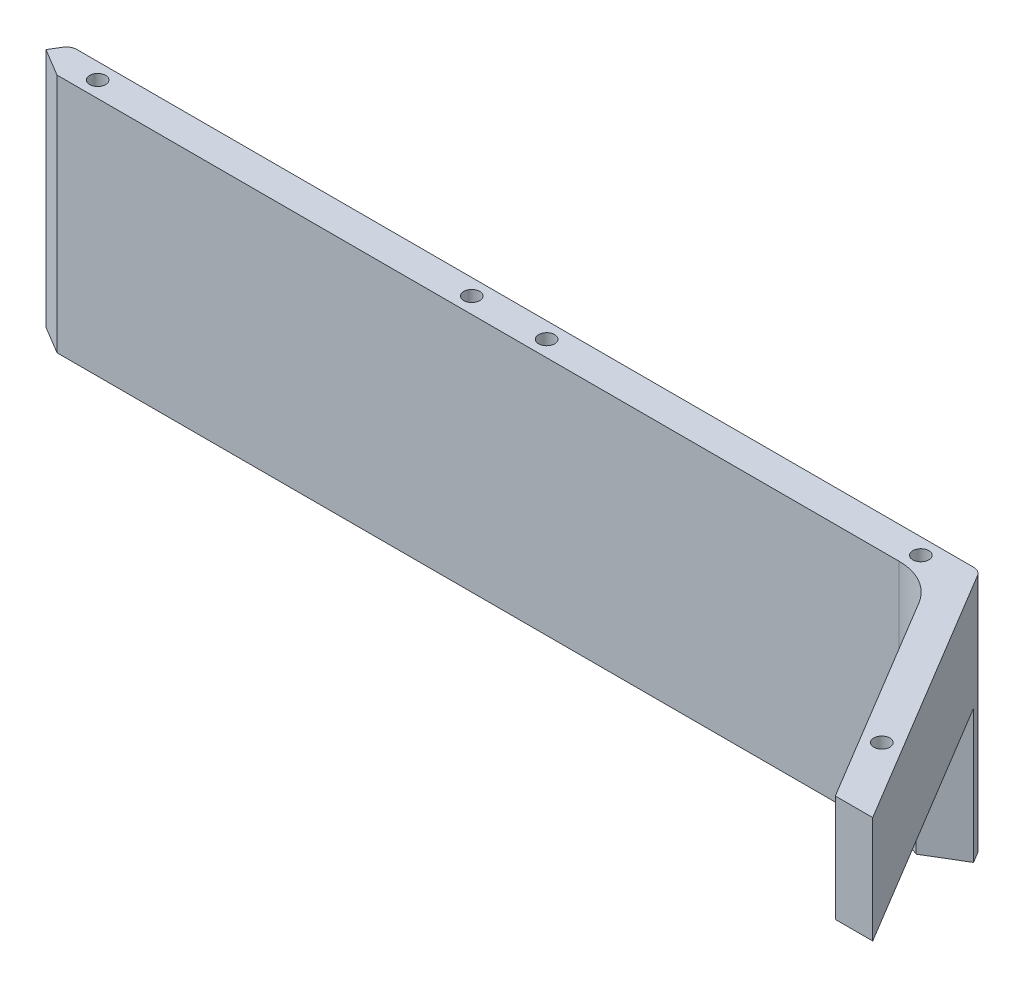
ISO-10303-21;
HEADER;
FILE_DESCRIPTION(('STEP AP214'),'2;1');
FILE_NAME('part.step','',(''),(''),'','','');
FILE_SCHEMA(('AUTOMOTIVE_DESIGN { 1 0 10303 214 1 1 1 1 }'));
ENDSEC;
DATA;
#1=APPLICATION_CONTEXT('core data for automotive mechanical design processes');
#2=APPLICATION_PROTOCOL_DEFINITION('international standard','automotive_design',2000,#1);
#3=PRODUCT_CONTEXT('',#1,'mechanical');
#4=PRODUCT('Part','Part','',(#3));
#5=PRODUCT_RELATED_PRODUCT_CATEGORY('part','',(#4));
#6=PRODUCT_DEFINITION_FORMATION('','',#4);
#7=PRODUCT_DEFINITION_CONTEXT('part definition',#1,'design');
#8=PRODUCT_DEFINITION('design','',#6,#7);
#9=PRODUCT_DEFINITION_SHAPE('','',#8);
#10=(LENGTH_UNIT() NAMED_UNIT(*) SI_UNIT(.MILLI.,.METRE.));
#11=(NAMED_UNIT(*) PLANE_ANGLE_UNIT() SI_UNIT($,.RADIAN.));
#12=(NAMED_UNIT(*) SI_UNIT($,.STERADIAN.) SOLID_ANGLE_UNIT());
#13=UNCERTAINTY_MEASURE_WITH_UNIT(LENGTH_MEASURE(1.E-05),#10,'distance_accuracy_value','');
#14=(GEOMETRIC_REPRESENTATION_CONTEXT(3) GLOBAL_UNCERTAINTY_ASSIGNED_CONTEXT((#13)) GLOBAL_UNIT_ASSIGNED_CONTEXT((#10,
#11,#12)) REPRESENTATION_CONTEXT('',''));
#15=CARTESIAN_POINT('',(0.,0.,0.));
#16=DIRECTION('',(0.,0.,1.));
#17=DIRECTION('',(1.,0.,0.));
#18=AXIS2_PLACEMENT_3D('',#15,#16,#17);
#19=CARTESIAN_POINT('',(115.,22.5,1.74329600357084E-13));
#20=DIRECTION('',(-0.857492925712544,0.,0.514495755427526));
#21=DIRECTION('',(0.514495755427526,0.,0.857492925712544));
#22=AXIS2_PLACEMENT_3D('',#19,#20,#21);
#23=PLANE('',#22);
#24=DIRECTION('',(0.,1.,0.));
#25=VECTOR('',#24,1.);
#26=CARTESIAN_POINT('',(86.7027334514861,2.5,-47.1621109141898));
#27=LINE('',#26,#25);
#28=CARTESIAN_POINT('',(86.7027334514861,-22.5,-47.1621109141898));
#29=VERTEX_POINT('',#28);
#30=CARTESIAN_POINT('',(86.7027334514861,2.5,-47.1621109141898));
#31=VERTEX_POINT('',#30);
#32=EDGE_CURVE('E247',#29,#31,#27,.T.);
#33=ORIENTED_EDGE('',*,*,#32,.F.);
#34=DIRECTION('',(-0.514495755427526,0.,-0.857492925712544));
#35=VECTOR('',#34,1.);
#36=CARTESIAN_POINT('',(115.,-22.5,1.74329600357084E-13));
#37=LINE('',#36,#35);
#38=CARTESIAN_POINT('',(85.582605093487,-22.5,-49.0289915108549));
#39=VERTEX_POINT('',#38);
#40=EDGE_CURVE('E176',#29,#39,#37,.T.);
#41=ORIENTED_EDGE('',*,*,#40,.T.);
#42=DIRECTION('',(0.,-1.,0.));
#43=VECTOR('',#42,1.);
#44=CARTESIAN_POINT('',(85.582605093487,22.5,-49.0289915108549));
#45=LINE('',#44,#43);
#46=CARTESIAN_POINT('',(85.582605093487,22.5,-49.0289915108549));
#47=VERTEX_POINT('',#46);
#48=EDGE_CURVE('E191',#39,#47,#45,.F.);
#49=ORIENTED_EDGE('',*,*,#48,.T.);
#50=DIRECTION('',(-0.514495755427526,0.,-0.857492925712544));
#51=VECTOR('',#50,1.);
#52=CARTESIAN_POINT('',(115.,22.5,1.74329600357084E-13));
#53=LINE('',#52,#51);
#54=CARTESIAN_POINT('',(115.,22.5,1.74329600357084E-13));
#55=VERTEX_POINT('',#54);
#56=EDGE_CURVE('E168',#55,#47,#53,.T.);
#57=ORIENTED_EDGE('',*,*,#56,.F.);
#58=DIRECTION('',(0.,-1.,0.));
#59=VECTOR('',#58,1.);
#60=CARTESIAN_POINT('',(115.,22.5,1.74329600357084E-13));
#61=LINE('',#60,#59);
#62=CARTESIAN_POINT('',(115.,2.50000000000001,1.74329600357084E-13));
#63=VERTEX_POINT('',#62);
#64=EDGE_CURVE('E173',#55,#63,#61,.T.);
#65=ORIENTED_EDGE('',*,*,#64,.T.);
#66=DIRECTION('',(0.514495755427526,0.,0.857492925712544));
#67=VECTOR('',#66,1.);
#68=CARTESIAN_POINT('',(115.,2.5,1.73472347597681E-13));
#69=LINE('',#68,#67);
#70=EDGE_CURVE('E249',#31,#63,#69,.T.);
#71=ORIENTED_EDGE('',*,*,#70,.F.);
#72=EDGE_LOOP('',(#33,#41,#49,#57,#65,#71));
#73=FACE_BOUND('',#72,.T.);
#74=ADVANCED_FACE('F39',(#73),#23,.F.);
#75=CARTESIAN_POINT('',(81.6,22.5,-43.9999999999998));
#76=DIRECTION('',(0.,0.,-1.));
#77=DIRECTION('',(-1.,0.,0.));
#78=AXIS2_PLACEMENT_3D('',#75,#76,#77);
#79=PLANE('',#78);
#80=DIRECTION('',(1.,0.,0.));
#81=VECTOR('',#80,1.);
#82=CARTESIAN_POINT('',(81.6,-22.5,-43.9999999999998));
#83=LINE('',#82,#81);
#84=CARTESIAN_POINT('',(-81.6000000000001,-22.5,-43.9999999999998));
#85=VERTEX_POINT('',#84);
#86=CARTESIAN_POINT('',(75.9380962103094,-22.5,-43.9999999999998));
#87=VERTEX_POINT('',#86);
#88=EDGE_CURVE('E172',#85,#87,#83,.T.);
#89=ORIENTED_EDGE('',*,*,#88,.T.);
#90=DIRECTION('',(0.,-1.,0.));
#91=VECTOR('',#90,1.);
#92=CARTESIAN_POINT('',(75.9380962103094,22.5,-43.9999999999998));
#93=LINE('',#92,#91);
#94=CARTESIAN_POINT('',(75.9380962103094,22.5,-43.9999999999998));
#95=VERTEX_POINT('',#94);
#96=EDGE_CURVE('E154',#87,#95,#93,.F.);
#97=ORIENTED_EDGE('',*,*,#96,.T.);
#98=DIRECTION('',(1.,0.,0.));
#99=VECTOR('',#98,1.);
#100=CARTESIAN_POINT('',(81.6,22.5,-43.9999999999998));
#101=LINE('',#100,#99);
#102=CARTESIAN_POINT('',(-81.6000000000001,22.5,-43.9999999999998));
#103=VERTEX_POINT('',#102);
#104=EDGE_CURVE('E144',#103,#95,#101,.T.);
#105=ORIENTED_EDGE('',*,*,#104,.F.);
#106=DIRECTION('',(0.,-1.,0.));
#107=VECTOR('',#106,1.);
#108=CARTESIAN_POINT('',(-81.6,22.5,-43.9999999999998));
#109=LINE('',#108,#107);
#110=EDGE_CURVE('E127',#103,#85,#109,.T.);
#111=ORIENTED_EDGE('',*,*,#110,.T.);
#112=EDGE_LOOP('',(#89,#97,#105,#111));
#113=FACE_BOUND('',#112,.T.);
#114=ADVANCED_FACE('F148',(#113),#79,.F.);
#115=CARTESIAN_POINT('',(81.6,22.5,-43.9999999999998));
#116=DIRECTION('',(0.857492925712544,0.,-0.514495755427526));
#117=DIRECTION('',(-0.514495755427526,0.,-0.857492925712544));
#118=AXIS2_PLACEMENT_3D('',#115,#116,#117);
#119=PLANE('',#118);
#120=DIRECTION('',(0.514495755427526,0.,0.857492925712544));
#121=VECTOR('',#120,1.);
#122=CARTESIAN_POINT('',(81.6,22.5,-43.9999999999998));
#123=LINE('',#122,#121);
#124=CARTESIAN_POINT('',(84.5130254674348,22.5,-39.1449575542751));
#125=VERTEX_POINT('',#124);
#126=CARTESIAN_POINT('',(108.,22.5,1.73472347597681E-13));
#127=VERTEX_POINT('',#126);
#128=EDGE_CURVE('E155',#125,#127,#123,.T.);
#129=ORIENTED_EDGE('',*,*,#128,.F.);
#130=DIRECTION('',(0.,-1.,0.));
#131=VECTOR('',#130,1.);
#132=CARTESIAN_POINT('',(84.5130254674348,2.5,-39.1449575542751));
#133=LINE('',#132,#131);
#134=CARTESIAN_POINT('',(84.5130254674348,2.5,-39.1449575542751));
#135=VERTEX_POINT('',#134);
#136=EDGE_CURVE('E207',#125,#135,#133,.T.);
#137=ORIENTED_EDGE('',*,*,#136,.T.);
#138=DIRECTION('',(0.514495755427526,0.,0.857492925712544));
#139=VECTOR('',#138,1.);
#140=CARTESIAN_POINT('',(81.6,2.5,-43.9999999999998));
#141=LINE('',#140,#139);
#142=CARTESIAN_POINT('',(108.,2.5,1.73472347597681E-13));
#143=VERTEX_POINT('',#142);
#144=EDGE_CURVE('E223',#135,#143,#141,.T.);
#145=ORIENTED_EDGE('',*,*,#144,.T.);
#146=DIRECTION('',(0.,-1.,0.));
#147=VECTOR('',#146,1.);
#148=CARTESIAN_POINT('',(108.,22.5,1.73472347597681E-13));
#149=LINE('',#148,#147);
#150=EDGE_CURVE('E137',#127,#143,#149,.T.);
#151=ORIENTED_EDGE('',*,*,#150,.F.);
#152=EDGE_LOOP('',(#129,#137,#145,#151));
#153=FACE_BOUND('',#152,.T.);
#154=ADVANCED_FACE('F221',(#153),#119,.F.);
#155=CARTESIAN_POINT('',(108.,22.5,1.73472347597681E-13));
#156=DIRECTION('',(0.,0.,-1.));
#157=DIRECTION('',(-1.,0.,0.));
#158=AXIS2_PLACEMENT_3D('',#155,#156,#157);
#159=PLANE('',#158);
#160=ORIENTED_EDGE('',*,*,#150,.T.);
#161=DIRECTION('',(1.,0.,0.));
#162=VECTOR('',#161,1.);
#163=CARTESIAN_POINT('',(108.,2.5,1.73472347597681E-13));
#164=LINE('',#163,#162);
#165=EDGE_CURVE('E202',#143,#63,#164,.T.);
#166=ORIENTED_EDGE('',*,*,#165,.T.);
#167=ORIENTED_EDGE('',*,*,#64,.F.);
#168=DIRECTION('',(1.,0.,0.));
#169=VECTOR('',#168,1.);
#170=CARTESIAN_POINT('',(108.,22.5,1.73472347597681E-13));
#171=LINE('',#170,#169);
#172=EDGE_CURVE('E156',#127,#55,#171,.T.);
#173=ORIENTED_EDGE('',*,*,#172,.F.);
#174=EDGE_LOOP('',(#160,#166,#167,#173));
#175=FACE_BOUND('',#174,.T.);
#176=ADVANCED_FACE('F226',(#175),#159,.F.);
#177=CARTESIAN_POINT('',(-85.,22.5,-49.9999999999998));
#178=DIRECTION('',(0.,0.,1.));
#179=DIRECTION('',(1.,0.,0.));
#180=AXIS2_PLACEMENT_3D('',#177,#178,#179);
#181=PLANE('',#180);
#182=DIRECTION('',(-1.,0.,0.));
#183=VECTOR('',#182,1.);
#184=CARTESIAN_POINT('',(-85.,22.5,-49.9999999999998));
#185=LINE('',#184,#183);
#186=CARTESIAN_POINT('',(83.8676192420619,22.5,-49.9999999999998));
#187=VERTEX_POINT('',#186);
#188=CARTESIAN_POINT('',(-83.8676192420619,22.5,-49.9999999999998));
#189=VERTEX_POINT('',#188);
#190=EDGE_CURVE('E169',#187,#189,#185,.T.);
#191=ORIENTED_EDGE('',*,*,#190,.F.);
#192=DIRECTION('',(0.,-1.,0.));
#193=VECTOR('',#192,1.);
#194=CARTESIAN_POINT('',(83.8676192420619,22.5,-49.9999999999998));
#195=LINE('',#194,#193);
#196=CARTESIAN_POINT('',(83.8676192420619,-22.5,-49.9999999999998));
#197=VERTEX_POINT('',#196);
#198=EDGE_CURVE('E187',#187,#197,#195,.T.);
#199=ORIENTED_EDGE('',*,*,#198,.T.);
#200=DIRECTION('',(-1.,0.,0.));
#201=VECTOR('',#200,1.);
#202=CARTESIAN_POINT('',(-85.,-22.5,-49.9999999999998));
#203=LINE('',#202,#201);
#204=CARTESIAN_POINT('',(-83.8676192420619,-22.5,-49.9999999999998));
#205=VERTEX_POINT('',#204);
#206=EDGE_CURVE('E158',#197,#205,#203,.T.);
#207=ORIENTED_EDGE('',*,*,#206,.T.);
#208=DIRECTION('',(0.,-1.,0.));
#209=VECTOR('',#208,1.);
#210=CARTESIAN_POINT('',(-83.8676192420619,22.5,-49.9999999999998));
#211=LINE('',#210,#209);
#212=EDGE_CURVE('E140',#205,#189,#211,.F.);
#213=ORIENTED_EDGE('',*,*,#212,.T.);
#214=EDGE_LOOP('',(#191,#199,#207,#213));
#215=FACE_BOUND('',#214,.T.);
#216=ADVANCED_FACE('F237',(#215),#181,.F.);
#217=CARTESIAN_POINT('',(-115.,22.5,1.74329600357084E-13));
#218=DIRECTION('',(0.857492925712544,0.,0.514495755427526));
#219=DIRECTION('',(0.514495755427526,0.,-0.857492925712544));
#220=AXIS2_PLACEMENT_3D('',#217,#218,#219);
#221=PLANE('',#220);
#222=DIRECTION('',(-0.514495755427526,0.,0.857492925712544));
#223=VECTOR('',#222,1.);
#224=CARTESIAN_POINT('',(-115.,-22.5,1.74329600357084E-13));
#225=LINE('',#224,#223);
#226=CARTESIAN_POINT('',(-85.582605093487,-22.5,-49.0289915108549));
#227=VERTEX_POINT('',#226);
#228=CARTESIAN_POINT('',(-86.7470588235295,-22.5,-47.0882352941175));
#229=VERTEX_POINT('',#228);
#230=EDGE_CURVE('E151',#227,#229,#225,.T.);
#231=ORIENTED_EDGE('',*,*,#230,.T.);
#232=DIRECTION('',(0.,1.,0.));
#233=VECTOR('',#232,1.);
#234=CARTESIAN_POINT('',(-86.7470588235294,22.5,-47.0882352941175));
#235=LINE('',#234,#233);
#236=CARTESIAN_POINT('',(-86.7470588235295,22.5,-47.0882352941175));
#237=VERTEX_POINT('',#236);
#238=EDGE_CURVE('E149',#229,#237,#235,.T.);
#239=ORIENTED_EDGE('',*,*,#238,.T.);
#240=DIRECTION('',(-0.514495755427526,0.,0.857492925712544));
#241=VECTOR('',#240,1.);
#242=CARTESIAN_POINT('',(-115.,22.5,1.74329600357084E-13));
#243=LINE('',#242,#241);
#244=CARTESIAN_POINT('',(-85.582605093487,22.5,-49.0289915108549));
#245=VERTEX_POINT('',#244);
#246=EDGE_CURVE('E150',#245,#237,#243,.T.);
#247=ORIENTED_EDGE('',*,*,#246,.F.);
#248=DIRECTION('',(0.,-1.,0.));
#249=VECTOR('',#248,1.);
#250=CARTESIAN_POINT('',(-85.582605093487,22.5,-49.0289915108549));
#251=LINE('',#250,#249);
#252=EDGE_CURVE('E198',#245,#227,#251,.T.);
#253=ORIENTED_EDGE('',*,*,#252,.T.);
#254=EDGE_LOOP('',(#231,#239,#247,#253));
#255=FACE_BOUND('',#254,.T.);
#256=ADVANCED_FACE('F250',(#255),#221,.F.);
#257=CARTESIAN_POINT('',(0.,22.5,0.));
#258=DIRECTION('',(0.,-1.,0.));
#259=DIRECTION('',(0.,0.,-1.));
#260=AXIS2_PLACEMENT_3D('',#257,#258,#259);
#261=PLANE('',#260);
#262=CARTESIAN_POINT('',(-77.,22.5,-46.9999999999998));
#263=DIRECTION('',(0.,1.,0.));
#264=DIRECTION('',(0.,0.,1.));
#265=AXIS2_PLACEMENT_3D('',#262,#263,#264);
#266=CIRCLE('',#265,1.5);
#267=CARTESIAN_POINT('',(-77.,22.5,-45.4999999999998));
#268=VERTEX_POINT('',#267);
#269=EDGE_CURVE('E180',#268,#268,#266,.T.);
#270=ORIENTED_EDGE('',*,*,#269,.F.);
#271=EDGE_LOOP('',(#270));
#272=FACE_BOUND('',#271,.T.);
#273=CARTESIAN_POINT('',(-7.00000000000001,22.5,-46.9999999999998));
#274=DIRECTION('',(0.,1.,0.));
#275=DIRECTION('',(0.,0.,1.));
#276=AXIS2_PLACEMENT_3D('',#273,#274,#275);
#277=CIRCLE('',#276,1.5);
#278=CARTESIAN_POINT('',(-7.00000000000001,22.5,-45.4999999999998));
#279=VERTEX_POINT('',#278);
#280=EDGE_CURVE('E265',#279,#279,#277,.T.);
#281=ORIENTED_EDGE('',*,*,#280,.F.);
#282=EDGE_LOOP('',(#281));
#283=FACE_BOUND('',#282,.T.);
#284=CARTESIAN_POINT('',(7.00000000000001,22.5,-46.9999999999998));
#285=DIRECTION('',(0.,1.,0.));
#286=DIRECTION('',(0.,0.,-1.));
#287=AXIS2_PLACEMENT_3D('',#284,#285,#286);
#288=CIRCLE('',#287,1.5);
#289=CARTESIAN_POINT('',(7.00000000000001,22.5,-48.4999999999998));
#290=VERTEX_POINT('',#289);
#291=EDGE_CURVE('E268',#290,#290,#288,.T.);
#292=ORIENTED_EDGE('',*,*,#291,.F.);
#293=EDGE_LOOP('',(#292));
#294=FACE_BOUND('',#293,.T.);
#295=CARTESIAN_POINT('',(77.,22.5,-46.9999999999998));
#296=DIRECTION('',(0.,1.,0.));
#297=DIRECTION('',(0.,0.,-1.));
#298=AXIS2_PLACEMENT_3D('',#295,#296,#297);
#299=CIRCLE('',#298,1.5);
#300=CARTESIAN_POINT('',(77.,22.5,-48.4999999999998));
#301=VERTEX_POINT('',#300);
#302=EDGE_CURVE('E273',#301,#301,#299,.T.);
#303=ORIENTED_EDGE('',*,*,#302,.F.);
#304=EDGE_LOOP('',(#303));
#305=FACE_BOUND('',#304,.T.);
#306=CARTESIAN_POINT('',(103.701428863093,22.5,-12.9999999999998));
#307=DIRECTION('',(0.,1.,0.));
#308=DIRECTION('',(0.,0.,-1.));
#309=AXIS2_PLACEMENT_3D('',#306,#307,#308);
#310=CIRCLE('',#309,1.5);
#311=CARTESIAN_POINT('',(103.701428863093,22.5,-14.4999999999998));
#312=VERTEX_POINT('',#311);
#313=EDGE_CURVE('E278',#312,#312,#310,.T.);
#314=ORIENTED_EDGE('',*,*,#313,.F.);
#315=EDGE_LOOP('',(#314));
#316=FACE_BOUND('',#315,.T.);
#317=ORIENTED_EDGE('',*,*,#246,.T.);
#318=DIRECTION('',(0.857492925712544,0.,0.514495755427526));
#319=VECTOR('',#318,1.);
#320=CARTESIAN_POINT('',(-90.1749292571255,22.5,-49.1449575542751));
#321=LINE('',#320,#319);
#322=EDGE_CURVE('E126',#237,#103,#321,.T.);
#323=ORIENTED_EDGE('',*,*,#322,.T.);
#324=ORIENTED_EDGE('',*,*,#104,.T.);
#325=CARTESIAN_POINT('',(75.9380962103094,22.5,-33.9999999999998));
#326=DIRECTION('',(0.,-1.,0.));
#327=DIRECTION('',(0.,0.,-1.));
#328=AXIS2_PLACEMENT_3D('',#325,#326,#327);
#329=CIRCLE('',#328,10.);
#330=EDGE_CURVE('E11',#95,#125,#329,.T.);
#331=ORIENTED_EDGE('',*,*,#330,.T.);
#332=ORIENTED_EDGE('',*,*,#128,.T.);
#333=ORIENTED_EDGE('',*,*,#172,.T.);
#334=ORIENTED_EDGE('',*,*,#56,.T.);
#335=CARTESIAN_POINT('',(83.8676192420619,22.5,-47.9999999999998));
#336=DIRECTION('',(0.,-1.,0.));
#337=DIRECTION('',(0.,0.,-1.));
#338=AXIS2_PLACEMENT_3D('',#335,#336,#337);
#339=CIRCLE('',#338,2.);
#340=EDGE_CURVE('E200',#47,#187,#339,.F.);
#341=ORIENTED_EDGE('',*,*,#340,.T.);
#342=ORIENTED_EDGE('',*,*,#190,.T.);
#343=CARTESIAN_POINT('',(-83.8676192420619,22.5,-47.9999999999998));
#344=DIRECTION('',(0.,-1.,0.));
#345=DIRECTION('',(0.,0.,-1.));
#346=AXIS2_PLACEMENT_3D('',#343,#344,#345);
#347=CIRCLE('',#346,2.);
#348=EDGE_CURVE('E197',#189,#245,#347,.F.);
#349=ORIENTED_EDGE('',*,*,#348,.T.);
#350=EDGE_LOOP('',(#317,#323,#324,#331,#332,#333,#334,#341,#342,#349));
#351=FACE_BOUND('',#350,.T.);
#352=ADVANCED_FACE('F141',(#272,#283,#294,#305,#316,#351),#261,.F.);
#353=CARTESIAN_POINT('',(0.,-22.5,0.));
#354=DIRECTION('',(0.,-1.,0.));
#355=DIRECTION('',(0.,0.,-1.));
#356=AXIS2_PLACEMENT_3D('',#353,#354,#355);
#357=PLANE('',#356);
#358=DIRECTION('',(0.857492925712544,0.,0.514495755427526));
#359=VECTOR('',#358,1.);
#360=CARTESIAN_POINT('',(-90.1749292571255,-22.5,-49.1449575542751));
#361=LINE('',#360,#359);
#362=EDGE_CURVE('E134',#229,#85,#361,.T.);
#363=ORIENTED_EDGE('',*,*,#362,.F.);
#364=ORIENTED_EDGE('',*,*,#230,.F.);
#365=CARTESIAN_POINT('',(-83.8676192420619,-22.5,-47.9999999999998));
#366=DIRECTION('',(0.,-1.,0.));
#367=DIRECTION('',(0.,0.,-1.));
#368=AXIS2_PLACEMENT_3D('',#365,#366,#367);
#369=CIRCLE('',#368,2.);
#370=EDGE_CURVE('E186',#227,#205,#369,.T.);
#371=ORIENTED_EDGE('',*,*,#370,.T.);
#372=ORIENTED_EDGE('',*,*,#206,.F.);
#373=CARTESIAN_POINT('',(83.8676192420619,-22.5,-47.9999999999998));
#374=DIRECTION('',(0.,-1.,0.));
#375=DIRECTION('',(0.,0.,-1.));
#376=AXIS2_PLACEMENT_3D('',#373,#374,#375);
#377=CIRCLE('',#376,2.);
#378=EDGE_CURVE('E192',#197,#39,#377,.T.);
#379=ORIENTED_EDGE('',*,*,#378,.T.);
#380=ORIENTED_EDGE('',*,*,#40,.F.);
#381=DIRECTION('',(0.857492925712544,0.,-0.514495755427526));
#382=VECTOR('',#381,1.);
#383=CARTESIAN_POINT('',(78.1278041943606,-22.5,-42.0171533599145));
#384=LINE('',#383,#382);
#385=CARTESIAN_POINT('',(79.9975237245606,-22.5,-43.1389850780345));
#386=VERTEX_POINT('',#385);
#387=EDGE_CURVE('E53',#386,#29,#384,.T.);
#388=ORIENTED_EDGE('',*,*,#387,.F.);
#389=CARTESIAN_POINT('',(75.9380962103094,-22.5,-33.9999999999998));
#390=DIRECTION('',(0.,-1.,0.));
#391=DIRECTION('',(0.,0.,-1.));
#392=AXIS2_PLACEMENT_3D('',#389,#390,#391);
#393=CIRCLE('',#392,10.);
#394=EDGE_CURVE('E50',#386,#87,#393,.F.);
#395=ORIENTED_EDGE('',*,*,#394,.T.);
#396=ORIENTED_EDGE('',*,*,#88,.F.);
#397=EDGE_LOOP('',(#363,#364,#371,#372,#379,#380,#388,#395,#396));
#398=FACE_BOUND('',#397,.T.);
#399=ADVANCED_FACE('F211',(#398),#357,.T.);
#400=CARTESIAN_POINT('',(103.701428863093,17.5,-12.9999999999998));
#401=DIRECTION('',(0.,1.,0.));
#402=DIRECTION('',(0.,0.,1.));
#403=AXIS2_PLACEMENT_3D('',#400,#401,#402);
#404=CYLINDRICAL_SURFACE('',#403,1.5);
#405=CARTESIAN_POINT('',(103.701428863093,17.5,-12.9999999999998));
#406=DIRECTION('',(0.,1.,0.));
#407=DIRECTION('',(0.,0.,-1.));
#408=AXIS2_PLACEMENT_3D('',#405,#406,#407);
#409=CIRCLE('',#408,1.5);
#410=CARTESIAN_POINT('',(103.701428863093,17.5,-14.4999999999998));
#411=VERTEX_POINT('',#410);
#412=EDGE_CURVE('E162',#411,#411,#409,.T.);
#413=ORIENTED_EDGE('',*,*,#412,.F.);
#414=EDGE_LOOP('',(#413));
#415=FACE_BOUND('',#414,.T.);
#416=ORIENTED_EDGE('',*,*,#313,.T.);
#417=EDGE_LOOP('',(#416));
#418=FACE_BOUND('',#417,.T.);
#419=ADVANCED_FACE('F288',(#415,#418),#404,.F.);
#420=CARTESIAN_POINT('',(103.701428863093,17.5,-12.9999999999998));
#421=DIRECTION('',(0.,-1.,0.));
#422=DIRECTION('',(0.,0.,-1.));
#423=AXIS2_PLACEMENT_3D('',#420,#421,#422);
#424=PLANE('',#423);
#425=ORIENTED_EDGE('',*,*,#412,.T.);
#426=EDGE_LOOP('',(#425));
#427=FACE_BOUND('',#426,.T.);
#428=ADVANCED_FACE('F290',(#427),#424,.F.);
#429=CARTESIAN_POINT('',(77.,17.5,-46.9999999999998));
#430=DIRECTION('',(0.,1.,0.));
#431=DIRECTION('',(0.,0.,1.));
#432=AXIS2_PLACEMENT_3D('',#429,#430,#431);
#433=CYLINDRICAL_SURFACE('',#432,1.5);
#434=CARTESIAN_POINT('',(77.,17.5,-46.9999999999998));
#435=DIRECTION('',(0.,1.,0.));
#436=DIRECTION('',(0.,0.,-1.));
#437=AXIS2_PLACEMENT_3D('',#434,#435,#436);
#438=CIRCLE('',#437,1.5);
#439=CARTESIAN_POINT('',(77.,17.5,-48.4999999999998));
#440=VERTEX_POINT('',#439);
#441=EDGE_CURVE('E279',#440,#440,#438,.T.);
#442=ORIENTED_EDGE('',*,*,#441,.F.);
#443=EDGE_LOOP('',(#442));
#444=FACE_BOUND('',#443,.T.);
#445=ORIENTED_EDGE('',*,*,#302,.T.);
#446=EDGE_LOOP('',(#445));
#447=FACE_BOUND('',#446,.T.);
#448=ADVANCED_FACE('F294',(#444,#447),#433,.F.);
#449=CARTESIAN_POINT('',(77.,17.5,-46.9999999999998));
#450=DIRECTION('',(0.,-1.,0.));
#451=DIRECTION('',(0.,0.,-1.));
#452=AXIS2_PLACEMENT_3D('',#449,#450,#451);
#453=PLANE('',#452);
#454=ORIENTED_EDGE('',*,*,#441,.T.);
#455=EDGE_LOOP('',(#454));
#456=FACE_BOUND('',#455,.T.);
#457=ADVANCED_FACE('F346',(#456),#453,.F.);
#458=CARTESIAN_POINT('',(7.00000000000001,17.5,-46.9999999999998));
#459=DIRECTION('',(0.,1.,0.));
#460=DIRECTION('',(0.,0.,1.));
#461=AXIS2_PLACEMENT_3D('',#458,#459,#460);
#462=CYLINDRICAL_SURFACE('',#461,1.5);
#463=CARTESIAN_POINT('',(7.00000000000001,17.5,-46.9999999999998));
#464=DIRECTION('',(0.,1.,0.));
#465=DIRECTION('',(0.,0.,-1.));
#466=AXIS2_PLACEMENT_3D('',#463,#464,#465);
#467=CIRCLE('',#466,1.5);
#468=CARTESIAN_POINT('',(7.00000000000001,17.5,-48.4999999999998));
#469=VERTEX_POINT('',#468);
#470=EDGE_CURVE('E275',#469,#469,#467,.T.);
#471=ORIENTED_EDGE('',*,*,#470,.F.);
#472=EDGE_LOOP('',(#471));
#473=FACE_BOUND('',#472,.T.);
#474=ORIENTED_EDGE('',*,*,#291,.T.);
#475=EDGE_LOOP('',(#474));
#476=FACE_BOUND('',#475,.T.);
#477=ADVANCED_FACE('F347',(#473,#476),#462,.F.);
#478=CARTESIAN_POINT('',(7.00000000000001,17.5,-46.9999999999998));
#479=DIRECTION('',(0.,-1.,0.));
#480=DIRECTION('',(0.,0.,-1.));
#481=AXIS2_PLACEMENT_3D('',#478,#479,#480);
#482=PLANE('',#481);
#483=ORIENTED_EDGE('',*,*,#470,.T.);
#484=EDGE_LOOP('',(#483));
#485=FACE_BOUND('',#484,.T.);
#486=ADVANCED_FACE('F342',(#485),#482,.F.);
#487=CARTESIAN_POINT('',(-7.00000000000001,17.5,-46.9999999999998));
#488=DIRECTION('',(0.,1.,0.));
#489=DIRECTION('',(0.,0.,1.));
#490=AXIS2_PLACEMENT_3D('',#487,#488,#489);
#491=CYLINDRICAL_SURFACE('',#490,1.5);
#492=CARTESIAN_POINT('',(-7.00000000000001,17.5,-46.9999999999998));
#493=DIRECTION('',(0.,1.,0.));
#494=DIRECTION('',(0.,0.,1.));
#495=AXIS2_PLACEMENT_3D('',#492,#493,#494);
#496=CIRCLE('',#495,1.5);
#497=CARTESIAN_POINT('',(-7.00000000000001,17.5,-45.4999999999998));
#498=VERTEX_POINT('',#497);
#499=EDGE_CURVE('E266',#498,#498,#496,.T.);
#500=ORIENTED_EDGE('',*,*,#499,.F.);
#501=EDGE_LOOP('',(#500));
#502=FACE_BOUND('',#501,.T.);
#503=ORIENTED_EDGE('',*,*,#280,.T.);
#504=EDGE_LOOP('',(#503));
#505=FACE_BOUND('',#504,.T.);
#506=ADVANCED_FACE('F336',(#502,#505),#491,.F.);
#507=CARTESIAN_POINT('',(-7.00000000000001,17.5,-46.9999999999998));
#508=DIRECTION('',(0.,1.,0.));
#509=DIRECTION('',(0.,0.,1.));
#510=AXIS2_PLACEMENT_3D('',#507,#508,#509);
#511=PLANE('',#510);
#512=ORIENTED_EDGE('',*,*,#499,.T.);
#513=EDGE_LOOP('',(#512));
#514=FACE_BOUND('',#513,.T.);
#515=ADVANCED_FACE('F332',(#514),#511,.T.);
#516=CARTESIAN_POINT('',(-77.,17.5,-46.9999999999998));
#517=DIRECTION('',(0.,1.,0.));
#518=DIRECTION('',(0.,0.,1.));
#519=AXIS2_PLACEMENT_3D('',#516,#517,#518);
#520=CYLINDRICAL_SURFACE('',#519,1.5);
#521=CARTESIAN_POINT('',(-77.,17.5,-46.9999999999998));
#522=DIRECTION('',(0.,1.,0.));
#523=DIRECTION('',(0.,0.,1.));
#524=AXIS2_PLACEMENT_3D('',#521,#522,#523);
#525=CIRCLE('',#524,1.5);
#526=CARTESIAN_POINT('',(-77.,17.5,-45.4999999999998));
#527=VERTEX_POINT('',#526);
#528=EDGE_CURVE('E258',#527,#527,#525,.T.);
#529=ORIENTED_EDGE('',*,*,#528,.F.);
#530=EDGE_LOOP('',(#529));
#531=FACE_BOUND('',#530,.T.);
#532=ORIENTED_EDGE('',*,*,#269,.T.);
#533=EDGE_LOOP('',(#532));
#534=FACE_BOUND('',#533,.T.);
#535=ADVANCED_FACE('F328',(#531,#534),#520,.F.);
#536=CARTESIAN_POINT('',(-77.,17.5,-46.9999999999998));
#537=DIRECTION('',(0.,1.,0.));
#538=DIRECTION('',(0.,0.,1.));
#539=AXIS2_PLACEMENT_3D('',#536,#537,#538);
#540=PLANE('',#539);
#541=ORIENTED_EDGE('',*,*,#528,.T.);
#542=EDGE_LOOP('',(#541));
#543=FACE_BOUND('',#542,.T.);
#544=ADVANCED_FACE('F317',(#543),#540,.T.);
#545=CARTESIAN_POINT('',(83.8676192420619,22.5,-47.9999999999998));
#546=DIRECTION('',(0.,-1.,0.));
#547=DIRECTION('',(0.,0.,-1.));
#548=AXIS2_PLACEMENT_3D('',#545,#546,#547);
#549=CYLINDRICAL_SURFACE('',#548,2.);
#550=ORIENTED_EDGE('',*,*,#340,.F.);
#551=ORIENTED_EDGE('',*,*,#48,.F.);
#552=ORIENTED_EDGE('',*,*,#378,.F.);
#553=ORIENTED_EDGE('',*,*,#198,.F.);
#554=EDGE_LOOP('',(#550,#551,#552,#553));
#555=FACE_BOUND('',#554,.T.);
#556=ADVANCED_FACE('F236',(#555),#549,.T.);
#557=CARTESIAN_POINT('',(-83.8676192420619,22.5,-47.9999999999998));
#558=DIRECTION('',(0.,-1.,0.));
#559=DIRECTION('',(0.,0.,-1.));
#560=AXIS2_PLACEMENT_3D('',#557,#558,#559);
#561=CYLINDRICAL_SURFACE('',#560,2.);
#562=ORIENTED_EDGE('',*,*,#348,.F.);
#563=ORIENTED_EDGE('',*,*,#212,.F.);
#564=ORIENTED_EDGE('',*,*,#370,.F.);
#565=ORIENTED_EDGE('',*,*,#252,.F.);
#566=EDGE_LOOP('',(#562,#563,#564,#565));
#567=FACE_BOUND('',#566,.T.);
#568=ADVANCED_FACE('F244',(#567),#561,.T.);
#569=CARTESIAN_POINT('',(106.425070742875,2.5,5.14495755427544));
#570=DIRECTION('',(0.,1.,0.));
#571=DIRECTION('',(0.,0.,1.));
#572=AXIS2_PLACEMENT_3D('',#569,#570,#571);
#573=PLANE('',#572);
#574=DIRECTION('',(0.857492925712544,0.,-0.514495755427526));
#575=VECTOR('',#574,1.);
#576=CARTESIAN_POINT('',(78.1278041943606,2.5,-42.0171533599145));
#577=LINE('',#576,#575);
#578=CARTESIAN_POINT('',(79.9975237245606,2.5,-43.1389850780345));
#579=VERTEX_POINT('',#578);
#580=EDGE_CURVE('E62',#579,#31,#577,.T.);
#581=ORIENTED_EDGE('',*,*,#580,.T.);
#582=ORIENTED_EDGE('',*,*,#70,.T.);
#583=ORIENTED_EDGE('',*,*,#165,.F.);
#584=ORIENTED_EDGE('',*,*,#144,.F.);
#585=CARTESIAN_POINT('',(75.9380962103094,2.5,-33.9999999999998));
#586=DIRECTION('',(0.,1.,0.));
#587=DIRECTION('',(0.,0.,1.));
#588=AXIS2_PLACEMENT_3D('',#585,#586,#587);
#589=CIRCLE('',#588,10.);
#590=EDGE_CURVE('E208',#135,#579,#589,.T.);
#591=ORIENTED_EDGE('',*,*,#590,.T.);
#592=EDGE_LOOP('',(#581,#582,#583,#584,#591));
#593=FACE_BOUND('',#592,.T.);
#594=ADVANCED_FACE('F320',(#593),#573,.F.);
#595=CARTESIAN_POINT('',(78.1278041943606,2.5,-42.0171533599145));
#596=DIRECTION('',(-0.514495755427526,0.,-0.857492925712544));
#597=DIRECTION('',(-0.857492925712544,0.,0.514495755427526));
#598=AXIS2_PLACEMENT_3D('',#595,#596,#597);
#599=PLANE('',#598);
#600=ORIENTED_EDGE('',*,*,#387,.T.);
#601=ORIENTED_EDGE('',*,*,#32,.T.);
#602=ORIENTED_EDGE('',*,*,#580,.F.);
#603=DIRECTION('',(0.,1.,0.));
#604=VECTOR('',#603,1.);
#605=CARTESIAN_POINT('',(79.9975237245606,2.5,-43.1389850780345));
#606=LINE('',#605,#604);
#607=EDGE_CURVE('E215',#579,#386,#606,.F.);
#608=ORIENTED_EDGE('',*,*,#607,.T.);
#609=EDGE_LOOP('',(#600,#601,#602,#608));
#610=FACE_BOUND('',#609,.T.);
#611=ADVANCED_FACE('F322',(#610),#599,.F.);
#612=CARTESIAN_POINT('',(-90.1749292571255,-22.5,-49.1449575542751));
#613=DIRECTION('',(0.514495755427526,0.,-0.857492925712544));
#614=DIRECTION('',(-0.857492925712545,0.,-0.514495755427526));
#615=AXIS2_PLACEMENT_3D('',#612,#613,#614);
#616=PLANE('',#615);
#617=ORIENTED_EDGE('',*,*,#362,.T.);
#618=ORIENTED_EDGE('',*,*,#110,.F.);
#619=ORIENTED_EDGE('',*,*,#322,.F.);
#620=ORIENTED_EDGE('',*,*,#238,.F.);
#621=EDGE_LOOP('',(#617,#618,#619,#620));
#622=FACE_BOUND('',#621,.T.);
#623=ADVANCED_FACE('F129',(#622),#616,.F.);
#624=CARTESIAN_POINT('',(75.9380962103094,22.5,-33.9999999999998));
#625=DIRECTION('',(0.,1.,0.));
#626=DIRECTION('',(0.,0.,1.));
#627=AXIS2_PLACEMENT_3D('',#624,#625,#626);
#628=CYLINDRICAL_SURFACE('',#627,10.);
#629=ORIENTED_EDGE('',*,*,#330,.F.);
#630=ORIENTED_EDGE('',*,*,#96,.F.);
#631=ORIENTED_EDGE('',*,*,#394,.F.);
#632=ORIENTED_EDGE('',*,*,#607,.F.);
#633=ORIENTED_EDGE('',*,*,#590,.F.);
#634=ORIENTED_EDGE('',*,*,#136,.F.);
#635=EDGE_LOOP('',(#629,#630,#631,#632,#633,#634));
#636=FACE_BOUND('',#635,.T.);
#637=ADVANCED_FACE('F41',(#636),#628,.F.);
#638=CLOSED_SHELL('',(#74,#114,#154,#176,#216,#256,#352,#399,#419,#428,#448,#457,#477,#486,#506,
#515,#535,#544,#556,#568,#594,#611,#623,#637));
#639=MANIFOLD_SOLID_BREP('B2',#638);
#640=ADVANCED_BREP_SHAPE_REPRESENTATION('',(#18,#639),#14);
#641=SHAPE_DEFINITION_REPRESENTATION(#9,#640);
ENDSEC;
END-ISO-10303-21;
